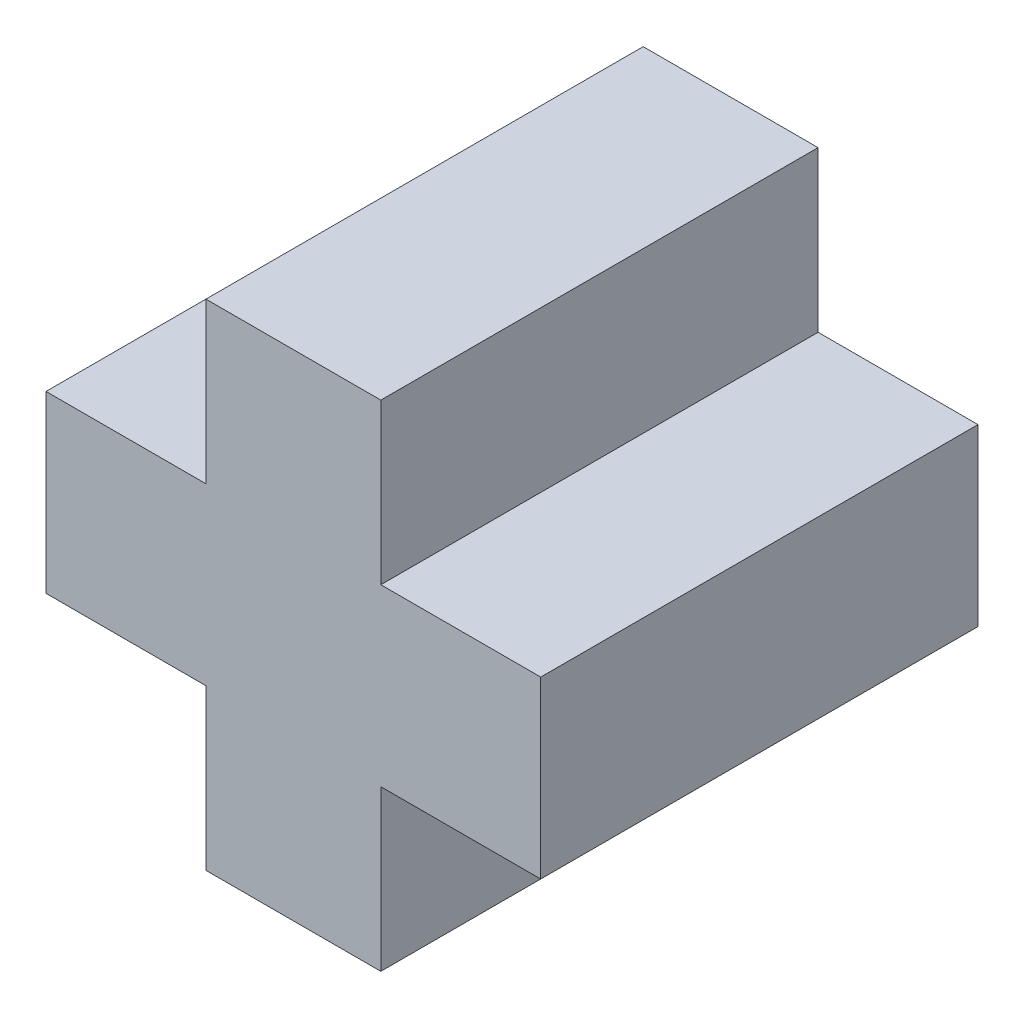
ISO-10303-21;
HEADER;
FILE_DESCRIPTION(('STEP AP214'),'2;1');
FILE_NAME('part.step','',(''),(''),'','','');
FILE_SCHEMA(('AUTOMOTIVE_DESIGN { 1 0 10303 214 1 1 1 1 }'));
ENDSEC;
DATA;
#1=APPLICATION_CONTEXT('core data for automotive mechanical design processes');
#2=APPLICATION_PROTOCOL_DEFINITION('international standard','automotive_design',2000,#1);
#3=PRODUCT_CONTEXT('',#1,'mechanical');
#4=PRODUCT('Part','Part','',(#3));
#5=PRODUCT_RELATED_PRODUCT_CATEGORY('part','',(#4));
#6=PRODUCT_DEFINITION_FORMATION('','',#4);
#7=PRODUCT_DEFINITION_CONTEXT('part definition',#1,'design');
#8=PRODUCT_DEFINITION('design','',#6,#7);
#9=PRODUCT_DEFINITION_SHAPE('','',#8);
#10=(LENGTH_UNIT() NAMED_UNIT(*) SI_UNIT(.MILLI.,.METRE.));
#11=(NAMED_UNIT(*) PLANE_ANGLE_UNIT() SI_UNIT($,.RADIAN.));
#12=(NAMED_UNIT(*) SI_UNIT($,.STERADIAN.) SOLID_ANGLE_UNIT());
#13=UNCERTAINTY_MEASURE_WITH_UNIT(LENGTH_MEASURE(1.E-05),#10,'distance_accuracy_value','');
#14=(GEOMETRIC_REPRESENTATION_CONTEXT(3) GLOBAL_UNCERTAINTY_ASSIGNED_CONTEXT((#13)) GLOBAL_UNIT_ASSIGNED_CONTEXT((#10,
#11,#12)) REPRESENTATION_CONTEXT('',''));
#15=CARTESIAN_POINT('',(0.,0.,0.));
#16=DIRECTION('',(0.,0.,1.));
#17=DIRECTION('',(1.,0.,0.));
#18=AXIS2_PLACEMENT_3D('',#15,#16,#17);
#19=CARTESIAN_POINT('',(5.,-14.142135623731,12.5));
#20=DIRECTION('',(-1.,0.,0.));
#21=DIRECTION('',(0.,0.,1.));
#22=AXIS2_PLACEMENT_3D('',#19,#20,#21);
#23=PLANE('',#22);
#24=DIRECTION('',(0.,1.,0.));
#25=VECTOR('',#24,1.);
#26=CARTESIAN_POINT('',(5.,-14.142135623731,-12.5));
#27=LINE('',#26,#25);
#28=CARTESIAN_POINT('',(5.,-14.142135623731,-12.5));
#29=VERTEX_POINT('',#28);
#30=CARTESIAN_POINT('',(5.,-5.,-12.5));
#31=VERTEX_POINT('',#30);
#32=EDGE_CURVE('E155',#29,#31,#27,.T.);
#33=ORIENTED_EDGE('',*,*,#32,.T.);
#34=DIRECTION('',(0.,0.,-1.));
#35=VECTOR('',#34,1.);
#36=CARTESIAN_POINT('',(5.,-5.,12.5));
#37=LINE('',#36,#35);
#38=CARTESIAN_POINT('',(5.,-5.,12.5));
#39=VERTEX_POINT('',#38);
#40=EDGE_CURVE('E11',#39,#31,#37,.T.);
#41=ORIENTED_EDGE('',*,*,#40,.F.);
#42=DIRECTION('',(0.,1.,0.));
#43=VECTOR('',#42,1.);
#44=CARTESIAN_POINT('',(5.,-14.142135623731,12.5));
#45=LINE('',#44,#43);
#46=CARTESIAN_POINT('',(5.,-14.142135623731,12.5));
#47=VERTEX_POINT('',#46);
#48=EDGE_CURVE('E177',#47,#39,#45,.T.);
#49=ORIENTED_EDGE('',*,*,#48,.F.);
#50=DIRECTION('',(0.,0.,-1.));
#51=VECTOR('',#50,1.);
#52=CARTESIAN_POINT('',(5.,-14.142135623731,12.5));
#53=LINE('',#52,#51);
#54=EDGE_CURVE('E151',#47,#29,#53,.T.);
#55=ORIENTED_EDGE('',*,*,#54,.T.);
#56=EDGE_LOOP('',(#33,#41,#49,#55));
#57=FACE_BOUND('',#56,.T.);
#58=ADVANCED_FACE('F35',(#57),#23,.F.);
#59=CARTESIAN_POINT('',(5.,-5.,12.5));
#60=DIRECTION('',(0.,1.,0.));
#61=DIRECTION('',(-1.,0.,0.));
#62=AXIS2_PLACEMENT_3D('',#59,#60,#61);
#63=PLANE('',#62);
#64=DIRECTION('',(1.,0.,0.));
#65=VECTOR('',#64,1.);
#66=CARTESIAN_POINT('',(5.,-5.,-12.5));
#67=LINE('',#66,#65);
#68=CARTESIAN_POINT('',(14.1421356237309,-5.,-12.5));
#69=VERTEX_POINT('',#68);
#70=EDGE_CURVE('E158',#31,#69,#67,.T.);
#71=ORIENTED_EDGE('',*,*,#70,.T.);
#72=DIRECTION('',(0.,0.,-1.));
#73=VECTOR('',#72,1.);
#74=CARTESIAN_POINT('',(14.1421356237309,-5.,12.5));
#75=LINE('',#74,#73);
#76=CARTESIAN_POINT('',(14.1421356237309,-5.,12.5));
#77=VERTEX_POINT('',#76);
#78=EDGE_CURVE('E43',#77,#69,#75,.T.);
#79=ORIENTED_EDGE('',*,*,#78,.F.);
#80=DIRECTION('',(1.,0.,0.));
#81=VECTOR('',#80,1.);
#82=CARTESIAN_POINT('',(5.,-5.,12.5));
#83=LINE('',#82,#81);
#84=EDGE_CURVE('E106',#39,#77,#83,.T.);
#85=ORIENTED_EDGE('',*,*,#84,.F.);
#86=ORIENTED_EDGE('',*,*,#40,.T.);
#87=EDGE_LOOP('',(#71,#79,#85,#86));
#88=FACE_BOUND('',#87,.T.);
#89=ADVANCED_FACE('F255',(#88),#63,.F.);
#90=CARTESIAN_POINT('',(14.1421356237309,-5.,12.5));
#91=DIRECTION('',(-1.,0.,0.));
#92=DIRECTION('',(0.,0.,1.));
#93=AXIS2_PLACEMENT_3D('',#90,#91,#92);
#94=PLANE('',#93);
#95=DIRECTION('',(0.,1.,0.));
#96=VECTOR('',#95,1.);
#97=CARTESIAN_POINT('',(14.1421356237309,-5.,-12.5));
#98=LINE('',#97,#96);
#99=CARTESIAN_POINT('',(14.1421356237309,5.,-12.5));
#100=VERTEX_POINT('',#99);
#101=EDGE_CURVE('E160',#69,#100,#98,.T.);
#102=ORIENTED_EDGE('',*,*,#101,.T.);
#103=DIRECTION('',(0.,0.,-1.));
#104=VECTOR('',#103,1.);
#105=CARTESIAN_POINT('',(14.1421356237309,5.,12.5));
#106=LINE('',#105,#104);
#107=CARTESIAN_POINT('',(14.1421356237309,5.,12.5));
#108=VERTEX_POINT('',#107);
#109=EDGE_CURVE('E196',#108,#100,#106,.T.);
#110=ORIENTED_EDGE('',*,*,#109,.F.);
#111=DIRECTION('',(0.,1.,0.));
#112=VECTOR('',#111,1.);
#113=CARTESIAN_POINT('',(14.1421356237309,-5.,12.5));
#114=LINE('',#113,#112);
#115=EDGE_CURVE('E204',#77,#108,#114,.T.);
#116=ORIENTED_EDGE('',*,*,#115,.F.);
#117=ORIENTED_EDGE('',*,*,#78,.T.);
#118=EDGE_LOOP('',(#102,#110,#116,#117));
#119=FACE_BOUND('',#118,.T.);
#120=ADVANCED_FACE('F202',(#119),#94,.F.);
#121=CARTESIAN_POINT('',(14.1421356237309,5.,12.5));
#122=DIRECTION('',(0.,-1.,0.));
#123=DIRECTION('',(1.,0.,0.));
#124=AXIS2_PLACEMENT_3D('',#121,#122,#123);
#125=PLANE('',#124);
#126=DIRECTION('',(-1.,0.,0.));
#127=VECTOR('',#126,1.);
#128=CARTESIAN_POINT('',(14.1421356237309,5.,-12.5));
#129=LINE('',#128,#127);
#130=CARTESIAN_POINT('',(5.,5.,-12.5));
#131=VERTEX_POINT('',#130);
#132=EDGE_CURVE('E162',#100,#131,#129,.T.);
#133=ORIENTED_EDGE('',*,*,#132,.T.);
#134=DIRECTION('',(0.,0.,-1.));
#135=VECTOR('',#134,1.);
#136=CARTESIAN_POINT('',(5.,5.,12.5));
#137=LINE('',#136,#135);
#138=CARTESIAN_POINT('',(5.,5.,12.5));
#139=VERTEX_POINT('',#138);
#140=EDGE_CURVE('E193',#139,#131,#137,.T.);
#141=ORIENTED_EDGE('',*,*,#140,.F.);
#142=DIRECTION('',(-1.,0.,0.));
#143=VECTOR('',#142,1.);
#144=CARTESIAN_POINT('',(14.1421356237309,5.,12.5));
#145=LINE('',#144,#143);
#146=EDGE_CURVE('E222',#108,#139,#145,.T.);
#147=ORIENTED_EDGE('',*,*,#146,.F.);
#148=ORIENTED_EDGE('',*,*,#109,.T.);
#149=EDGE_LOOP('',(#133,#141,#147,#148));
#150=FACE_BOUND('',#149,.T.);
#151=ADVANCED_FACE('F213',(#150),#125,.F.);
#152=CARTESIAN_POINT('',(5.,5.,12.5));
#153=DIRECTION('',(-1.,0.,0.));
#154=DIRECTION('',(0.,0.,1.));
#155=AXIS2_PLACEMENT_3D('',#152,#153,#154);
#156=PLANE('',#155);
#157=DIRECTION('',(0.,1.,0.));
#158=VECTOR('',#157,1.);
#159=CARTESIAN_POINT('',(5.,5.,-12.5));
#160=LINE('',#159,#158);
#161=CARTESIAN_POINT('',(5.,14.142135623731,-12.5));
#162=VERTEX_POINT('',#161);
#163=EDGE_CURVE('E164',#131,#162,#160,.T.);
#164=ORIENTED_EDGE('',*,*,#163,.T.);
#165=DIRECTION('',(0.,0.,-1.));
#166=VECTOR('',#165,1.);
#167=CARTESIAN_POINT('',(5.,14.142135623731,12.5));
#168=LINE('',#167,#166);
#169=CARTESIAN_POINT('',(5.,14.142135623731,12.5));
#170=VERTEX_POINT('',#169);
#171=EDGE_CURVE('E190',#170,#162,#168,.T.);
#172=ORIENTED_EDGE('',*,*,#171,.F.);
#173=DIRECTION('',(0.,1.,0.));
#174=VECTOR('',#173,1.);
#175=CARTESIAN_POINT('',(5.,5.,12.5));
#176=LINE('',#175,#174);
#177=EDGE_CURVE('E219',#139,#170,#176,.T.);
#178=ORIENTED_EDGE('',*,*,#177,.F.);
#179=ORIENTED_EDGE('',*,*,#140,.T.);
#180=EDGE_LOOP('',(#164,#172,#178,#179));
#181=FACE_BOUND('',#180,.T.);
#182=ADVANCED_FACE('F217',(#181),#156,.F.);
#183=CARTESIAN_POINT('',(5.,14.142135623731,12.5));
#184=DIRECTION('',(0.,-1.,0.));
#185=DIRECTION('',(0.,0.,-1.));
#186=AXIS2_PLACEMENT_3D('',#183,#184,#185);
#187=PLANE('',#186);
#188=DIRECTION('',(-1.,0.,0.));
#189=VECTOR('',#188,1.);
#190=CARTESIAN_POINT('',(5.,14.142135623731,-12.5));
#191=LINE('',#190,#189);
#192=CARTESIAN_POINT('',(-5.,14.142135623731,-12.5));
#193=VERTEX_POINT('',#192);
#194=EDGE_CURVE('E166',#162,#193,#191,.T.);
#195=ORIENTED_EDGE('',*,*,#194,.T.);
#196=DIRECTION('',(0.,0.,-1.));
#197=VECTOR('',#196,1.);
#198=CARTESIAN_POINT('',(-5.,14.142135623731,12.5));
#199=LINE('',#198,#197);
#200=CARTESIAN_POINT('',(-5.,14.142135623731,12.5));
#201=VERTEX_POINT('',#200);
#202=EDGE_CURVE('E187',#201,#193,#199,.T.);
#203=ORIENTED_EDGE('',*,*,#202,.F.);
#204=DIRECTION('',(-1.,0.,0.));
#205=VECTOR('',#204,1.);
#206=CARTESIAN_POINT('',(5.,14.142135623731,12.5));
#207=LINE('',#206,#205);
#208=EDGE_CURVE('E221',#170,#201,#207,.T.);
#209=ORIENTED_EDGE('',*,*,#208,.F.);
#210=ORIENTED_EDGE('',*,*,#171,.T.);
#211=EDGE_LOOP('',(#195,#203,#209,#210));
#212=FACE_BOUND('',#211,.T.);
#213=ADVANCED_FACE('F268',(#212),#187,.F.);
#214=CARTESIAN_POINT('',(-5.,14.142135623731,12.5));
#215=DIRECTION('',(1.,0.,0.));
#216=DIRECTION('',(0.,1.,0.));
#217=AXIS2_PLACEMENT_3D('',#214,#215,#216);
#218=PLANE('',#217);
#219=DIRECTION('',(0.,-1.,0.));
#220=VECTOR('',#219,1.);
#221=CARTESIAN_POINT('',(-5.,14.142135623731,-12.5));
#222=LINE('',#221,#220);
#223=CARTESIAN_POINT('',(-5.,4.99999999999999,-12.5));
#224=VERTEX_POINT('',#223);
#225=EDGE_CURVE('E168',#193,#224,#222,.T.);
#226=ORIENTED_EDGE('',*,*,#225,.T.);
#227=DIRECTION('',(0.,0.,-1.));
#228=VECTOR('',#227,1.);
#229=CARTESIAN_POINT('',(-5.,4.99999999999999,12.5));
#230=LINE('',#229,#228);
#231=CARTESIAN_POINT('',(-5.,4.99999999999999,12.5));
#232=VERTEX_POINT('',#231);
#233=EDGE_CURVE('E184',#232,#224,#230,.T.);
#234=ORIENTED_EDGE('',*,*,#233,.F.);
#235=DIRECTION('',(0.,-1.,0.));
#236=VECTOR('',#235,1.);
#237=CARTESIAN_POINT('',(-5.,14.142135623731,12.5));
#238=LINE('',#237,#236);
#239=EDGE_CURVE('E224',#201,#232,#238,.T.);
#240=ORIENTED_EDGE('',*,*,#239,.F.);
#241=ORIENTED_EDGE('',*,*,#202,.T.);
#242=EDGE_LOOP('',(#226,#234,#240,#241));
#243=FACE_BOUND('',#242,.T.);
#244=ADVANCED_FACE('F271',(#243),#218,.F.);
#245=CARTESIAN_POINT('',(-5.,4.99999999999999,12.5));
#246=DIRECTION('',(0.,-1.,0.));
#247=DIRECTION('',(1.,0.,0.));
#248=AXIS2_PLACEMENT_3D('',#245,#246,#247);
#249=PLANE('',#248);
#250=DIRECTION('',(-1.,0.,0.));
#251=VECTOR('',#250,1.);
#252=CARTESIAN_POINT('',(-5.,4.99999999999999,-12.5));
#253=LINE('',#252,#251);
#254=CARTESIAN_POINT('',(-14.142135623731,5.,-12.5));
#255=VERTEX_POINT('',#254);
#256=EDGE_CURVE('E170',#224,#255,#253,.T.);
#257=ORIENTED_EDGE('',*,*,#256,.T.);
#258=DIRECTION('',(0.,0.,-1.));
#259=VECTOR('',#258,1.);
#260=CARTESIAN_POINT('',(-14.142135623731,5.,12.5));
#261=LINE('',#260,#259);
#262=CARTESIAN_POINT('',(-14.142135623731,5.,12.5));
#263=VERTEX_POINT('',#262);
#264=EDGE_CURVE('E181',#263,#255,#261,.T.);
#265=ORIENTED_EDGE('',*,*,#264,.F.);
#266=DIRECTION('',(-1.,0.,0.));
#267=VECTOR('',#266,1.);
#268=CARTESIAN_POINT('',(-5.,4.99999999999999,12.5));
#269=LINE('',#268,#267);
#270=EDGE_CURVE('E230',#232,#263,#269,.T.);
#271=ORIENTED_EDGE('',*,*,#270,.F.);
#272=ORIENTED_EDGE('',*,*,#233,.T.);
#273=EDGE_LOOP('',(#257,#265,#271,#272));
#274=FACE_BOUND('',#273,.T.);
#275=ADVANCED_FACE('F236',(#274),#249,.F.);
#276=CARTESIAN_POINT('',(-14.142135623731,5.,12.5));
#277=DIRECTION('',(1.,0.,0.));
#278=DIRECTION('',(0.,0.,-1.));
#279=AXIS2_PLACEMENT_3D('',#276,#277,#278);
#280=PLANE('',#279);
#281=DIRECTION('',(0.,-1.,0.));
#282=VECTOR('',#281,1.);
#283=CARTESIAN_POINT('',(-14.142135623731,5.,-12.5));
#284=LINE('',#283,#282);
#285=CARTESIAN_POINT('',(-14.142135623731,-5.,-12.5));
#286=VERTEX_POINT('',#285);
#287=EDGE_CURVE('E172',#255,#286,#284,.T.);
#288=ORIENTED_EDGE('',*,*,#287,.T.);
#289=DIRECTION('',(0.,0.,-1.));
#290=VECTOR('',#289,1.);
#291=CARTESIAN_POINT('',(-14.142135623731,-5.,12.5));
#292=LINE('',#291,#290);
#293=CARTESIAN_POINT('',(-14.142135623731,-5.,12.5));
#294=VERTEX_POINT('',#293);
#295=EDGE_CURVE('E146',#294,#286,#292,.T.);
#296=ORIENTED_EDGE('',*,*,#295,.F.);
#297=DIRECTION('',(0.,-1.,0.));
#298=VECTOR('',#297,1.);
#299=CARTESIAN_POINT('',(-14.142135623731,5.,12.5));
#300=LINE('',#299,#298);
#301=EDGE_CURVE('E137',#263,#294,#300,.T.);
#302=ORIENTED_EDGE('',*,*,#301,.F.);
#303=ORIENTED_EDGE('',*,*,#264,.T.);
#304=EDGE_LOOP('',(#288,#296,#302,#303));
#305=FACE_BOUND('',#304,.T.);
#306=ADVANCED_FACE('F240',(#305),#280,.F.);
#307=CARTESIAN_POINT('',(-14.142135623731,-5.,12.5));
#308=DIRECTION('',(0.,1.,0.));
#309=DIRECTION('',(-1.,0.,0.));
#310=AXIS2_PLACEMENT_3D('',#307,#308,#309);
#311=PLANE('',#310);
#312=DIRECTION('',(1.,0.,0.));
#313=VECTOR('',#312,1.);
#314=CARTESIAN_POINT('',(-14.142135623731,-5.,-12.5));
#315=LINE('',#314,#313);
#316=CARTESIAN_POINT('',(-5.,-4.99999999999999,-12.5));
#317=VERTEX_POINT('',#316);
#318=EDGE_CURVE('E145',#286,#317,#315,.T.);
#319=ORIENTED_EDGE('',*,*,#318,.T.);
#320=DIRECTION('',(0.,0.,-1.));
#321=VECTOR('',#320,1.);
#322=CARTESIAN_POINT('',(-5.,-4.99999999999999,12.5));
#323=LINE('',#322,#321);
#324=CARTESIAN_POINT('',(-5.,-4.99999999999999,12.5));
#325=VERTEX_POINT('',#324);
#326=EDGE_CURVE('E142',#325,#317,#323,.T.);
#327=ORIENTED_EDGE('',*,*,#326,.F.);
#328=DIRECTION('',(1.,0.,0.));
#329=VECTOR('',#328,1.);
#330=CARTESIAN_POINT('',(-14.142135623731,-5.,12.5));
#331=LINE('',#330,#329);
#332=EDGE_CURVE('E131',#294,#325,#331,.T.);
#333=ORIENTED_EDGE('',*,*,#332,.F.);
#334=ORIENTED_EDGE('',*,*,#295,.T.);
#335=EDGE_LOOP('',(#319,#327,#333,#334));
#336=FACE_BOUND('',#335,.T.);
#337=ADVANCED_FACE('F143',(#336),#311,.F.);
#338=CARTESIAN_POINT('',(-5.,-4.99999999999999,12.5));
#339=DIRECTION('',(1.,0.,0.));
#340=DIRECTION('',(0.,1.,0.));
#341=AXIS2_PLACEMENT_3D('',#338,#339,#340);
#342=PLANE('',#341);
#343=DIRECTION('',(0.,-1.,0.));
#344=VECTOR('',#343,1.);
#345=CARTESIAN_POINT('',(-5.,-4.99999999999999,-12.5));
#346=LINE('',#345,#344);
#347=CARTESIAN_POINT('',(-5.,-14.142135623731,-12.5));
#348=VERTEX_POINT('',#347);
#349=EDGE_CURVE('E92',#317,#348,#346,.T.);
#350=ORIENTED_EDGE('',*,*,#349,.T.);
#351=DIRECTION('',(0.,0.,-1.));
#352=VECTOR('',#351,1.);
#353=CARTESIAN_POINT('',(-5.,-14.142135623731,12.5));
#354=LINE('',#353,#352);
#355=CARTESIAN_POINT('',(-5.,-14.142135623731,12.5));
#356=VERTEX_POINT('',#355);
#357=EDGE_CURVE('E147',#356,#348,#354,.T.);
#358=ORIENTED_EDGE('',*,*,#357,.F.);
#359=DIRECTION('',(0.,-1.,0.));
#360=VECTOR('',#359,1.);
#361=CARTESIAN_POINT('',(-5.,-4.99999999999999,12.5));
#362=LINE('',#361,#360);
#363=EDGE_CURVE('E135',#325,#356,#362,.T.);
#364=ORIENTED_EDGE('',*,*,#363,.F.);
#365=ORIENTED_EDGE('',*,*,#326,.T.);
#366=EDGE_LOOP('',(#350,#358,#364,#365));
#367=FACE_BOUND('',#366,.T.);
#368=ADVANCED_FACE('F149',(#367),#342,.F.);
#369=CARTESIAN_POINT('',(-5.,-14.142135623731,12.5));
#370=DIRECTION('',(0.,1.,0.));
#371=DIRECTION('',(0.,0.,1.));
#372=AXIS2_PLACEMENT_3D('',#369,#370,#371);
#373=PLANE('',#372);
#374=DIRECTION('',(1.,0.,0.));
#375=VECTOR('',#374,1.);
#376=CARTESIAN_POINT('',(-5.,-14.142135623731,-12.5));
#377=LINE('',#376,#375);
#378=EDGE_CURVE('E98',#348,#29,#377,.T.);
#379=ORIENTED_EDGE('',*,*,#378,.T.);
#380=ORIENTED_EDGE('',*,*,#54,.F.);
#381=DIRECTION('',(1.,0.,0.));
#382=VECTOR('',#381,1.);
#383=CARTESIAN_POINT('',(-5.,-14.142135623731,12.5));
#384=LINE('',#383,#382);
#385=EDGE_CURVE('E51',#356,#47,#384,.T.);
#386=ORIENTED_EDGE('',*,*,#385,.F.);
#387=ORIENTED_EDGE('',*,*,#357,.T.);
#388=EDGE_LOOP('',(#379,#380,#386,#387));
#389=FACE_BOUND('',#388,.T.);
#390=ADVANCED_FACE('F244',(#389),#373,.F.);
#391=CARTESIAN_POINT('',(0.,0.,12.5));
#392=DIRECTION('',(0.,0.,-1.));
#393=DIRECTION('',(-1.,0.,0.));
#394=AXIS2_PLACEMENT_3D('',#391,#392,#393);
#395=PLANE('',#394);
#396=ORIENTED_EDGE('',*,*,#48,.T.);
#397=ORIENTED_EDGE('',*,*,#84,.T.);
#398=ORIENTED_EDGE('',*,*,#115,.T.);
#399=ORIENTED_EDGE('',*,*,#146,.T.);
#400=ORIENTED_EDGE('',*,*,#177,.T.);
#401=ORIENTED_EDGE('',*,*,#208,.T.);
#402=ORIENTED_EDGE('',*,*,#239,.T.);
#403=ORIENTED_EDGE('',*,*,#270,.T.);
#404=ORIENTED_EDGE('',*,*,#301,.T.);
#405=ORIENTED_EDGE('',*,*,#332,.T.);
#406=ORIENTED_EDGE('',*,*,#363,.T.);
#407=ORIENTED_EDGE('',*,*,#385,.T.);
#408=EDGE_LOOP('',(#396,#397,#398,#399,#400,#401,#402,#403,#404,#405,#406,#407));
#409=FACE_BOUND('',#408,.T.);
#410=ADVANCED_FACE('F133',(#409),#395,.F.);
#411=CARTESIAN_POINT('',(0.,0.,-12.5));
#412=DIRECTION('',(0.,0.,-1.));
#413=DIRECTION('',(-1.,0.,0.));
#414=AXIS2_PLACEMENT_3D('',#411,#412,#413);
#415=PLANE('',#414);
#416=ORIENTED_EDGE('',*,*,#32,.F.);
#417=ORIENTED_EDGE('',*,*,#378,.F.);
#418=ORIENTED_EDGE('',*,*,#349,.F.);
#419=ORIENTED_EDGE('',*,*,#318,.F.);
#420=ORIENTED_EDGE('',*,*,#287,.F.);
#421=ORIENTED_EDGE('',*,*,#256,.F.);
#422=ORIENTED_EDGE('',*,*,#225,.F.);
#423=ORIENTED_EDGE('',*,*,#194,.F.);
#424=ORIENTED_EDGE('',*,*,#163,.F.);
#425=ORIENTED_EDGE('',*,*,#132,.F.);
#426=ORIENTED_EDGE('',*,*,#101,.F.);
#427=ORIENTED_EDGE('',*,*,#70,.F.);
#428=EDGE_LOOP('',(#416,#417,#418,#419,#420,#421,#422,#423,#424,#425,#426,#427));
#429=FACE_BOUND('',#428,.T.);
#430=ADVANCED_FACE('F208',(#429),#415,.T.);
#431=CLOSED_SHELL('',(#58,#89,#120,#151,#182,#213,#244,#275,#306,#337,#368,#390,#410,#430));
#432=MANIFOLD_SOLID_BREP('B2',#431);
#433=ADVANCED_BREP_SHAPE_REPRESENTATION('',(#18,#432),#14);
#434=SHAPE_DEFINITION_REPRESENTATION(#9,#433);
ENDSEC;
END-ISO-10303-21;
